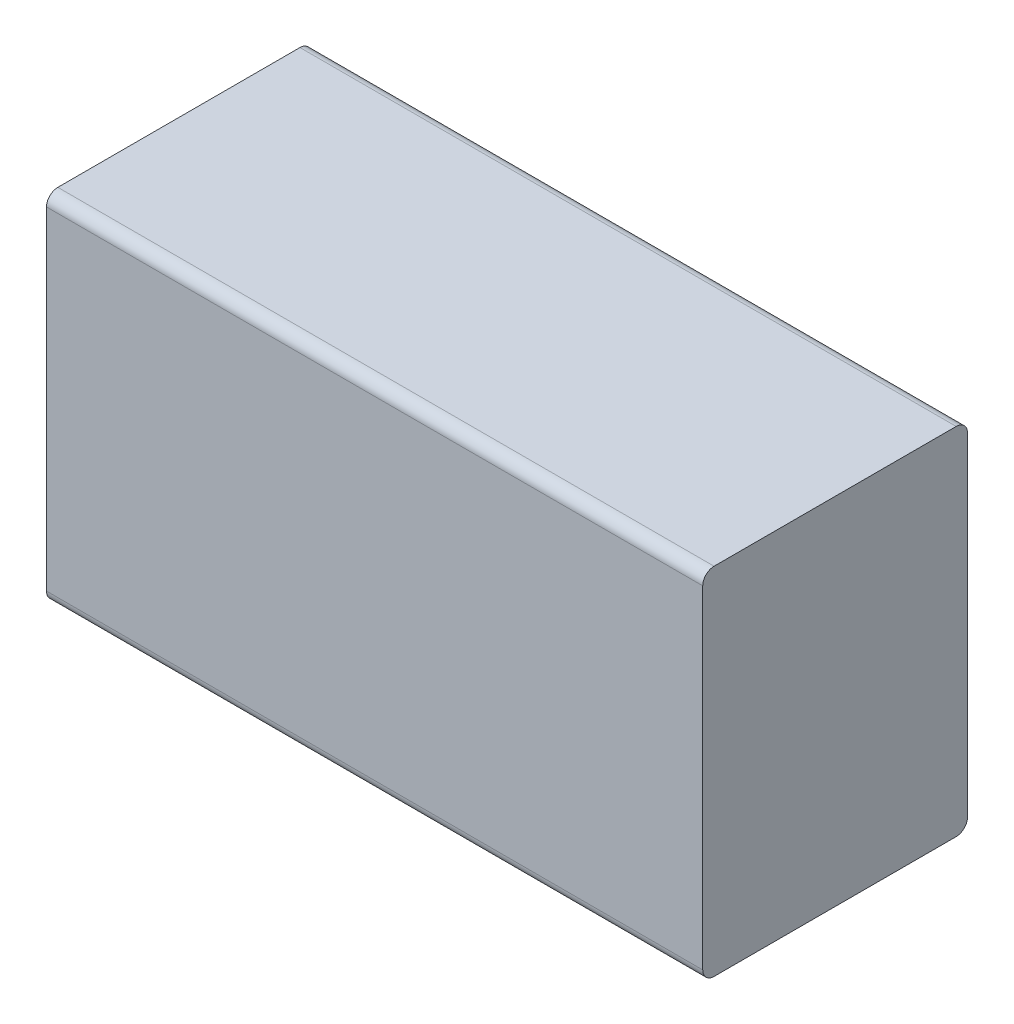
ISO-10303-21;
HEADER;
FILE_DESCRIPTION(('STEP AP214'),'2;1');
FILE_NAME('part.step','',(''),(''),'','','');
FILE_SCHEMA(('AUTOMOTIVE_DESIGN { 1 0 10303 214 1 1 1 1 }'));
ENDSEC;
DATA;
#1=APPLICATION_CONTEXT('core data for automotive mechanical design processes');
#2=APPLICATION_PROTOCOL_DEFINITION('international standard','automotive_design',2000,#1);
#3=PRODUCT_CONTEXT('',#1,'mechanical');
#4=PRODUCT('Part','Part','',(#3));
#5=PRODUCT_RELATED_PRODUCT_CATEGORY('part','',(#4));
#6=PRODUCT_DEFINITION_FORMATION('','',#4);
#7=PRODUCT_DEFINITION_CONTEXT('part definition',#1,'design');
#8=PRODUCT_DEFINITION('design','',#6,#7);
#9=PRODUCT_DEFINITION_SHAPE('','',#8);
#10=(LENGTH_UNIT() NAMED_UNIT(*) SI_UNIT(.MILLI.,.METRE.));
#11=(NAMED_UNIT(*) PLANE_ANGLE_UNIT() SI_UNIT($,.RADIAN.));
#12=(NAMED_UNIT(*) SI_UNIT($,.STERADIAN.) SOLID_ANGLE_UNIT());
#13=UNCERTAINTY_MEASURE_WITH_UNIT(LENGTH_MEASURE(1.E-05),#10,'distance_accuracy_value','');
#14=(GEOMETRIC_REPRESENTATION_CONTEXT(3) GLOBAL_UNCERTAINTY_ASSIGNED_CONTEXT((#13)) GLOBAL_UNIT_ASSIGNED_CONTEXT((#10,
#11,#12)) REPRESENTATION_CONTEXT('',''));
#15=CARTESIAN_POINT('',(0.,0.,0.));
#16=DIRECTION('',(0.,0.,1.));
#17=DIRECTION('',(1.,0.,0.));
#18=AXIS2_PLACEMENT_3D('',#15,#16,#17);
#19=CARTESIAN_POINT('',(0.,-0.735,1.135));
#20=DIRECTION('',(-1.,0.,0.));
#21=DIRECTION('',(0.,0.,-1.));
#22=AXIS2_PLACEMENT_3D('',#19,#20,#21);
#23=CYLINDRICAL_SURFACE('',#22,0.05);
#24=CARTESIAN_POINT('',(1.45,-0.735,1.135));
#25=DIRECTION('',(1.,0.,0.));
#26=DIRECTION('',(0.,0.,-1.));
#27=AXIS2_PLACEMENT_3D('',#24,#25,#26);
#28=CIRCLE('',#27,0.05);
#29=CARTESIAN_POINT('',(1.45,-0.735,1.185));
#30=VERTEX_POINT('',#29);
#31=CARTESIAN_POINT('',(1.45,-0.785,1.135));
#32=VERTEX_POINT('',#31);
#33=EDGE_CURVE('E42',#30,#32,#28,.T.);
#34=ORIENTED_EDGE('',*,*,#33,.F.);
#35=DIRECTION('',(1.,0.,0.));
#36=VECTOR('',#35,1.);
#37=CARTESIAN_POINT('',(1.45,-0.735,1.185));
#38=LINE('',#37,#36);
#39=CARTESIAN_POINT('',(-1.45,-0.735,1.185));
#40=VERTEX_POINT('',#39);
#41=EDGE_CURVE('E152',#40,#30,#38,.T.);
#42=ORIENTED_EDGE('',*,*,#41,.F.);
#43=CARTESIAN_POINT('',(-1.45,-0.735,1.135));
#44=DIRECTION('',(-1.,0.,0.));
#45=DIRECTION('',(0.,0.,-1.));
#46=AXIS2_PLACEMENT_3D('',#43,#44,#45);
#47=CIRCLE('',#46,0.05);
#48=CARTESIAN_POINT('',(-1.45,-0.785,1.135));
#49=VERTEX_POINT('',#48);
#50=EDGE_CURVE('E170',#49,#40,#47,.T.);
#51=ORIENTED_EDGE('',*,*,#50,.F.);
#52=DIRECTION('',(-1.,0.,0.));
#53=VECTOR('',#52,1.);
#54=CARTESIAN_POINT('',(-1.45,-0.785,1.135));
#55=LINE('',#54,#53);
#56=EDGE_CURVE('E11',#32,#49,#55,.T.);
#57=ORIENTED_EDGE('',*,*,#56,.F.);
#58=EDGE_LOOP('',(#34,#42,#51,#57));
#59=FACE_BOUND('',#58,.T.);
#60=ADVANCED_FACE('F17',(#59),#23,.T.);
#61=CARTESIAN_POINT('',(0.,-0.735,0.065));
#62=DIRECTION('',(1.,0.,0.));
#63=DIRECTION('',(0.,0.,1.));
#64=AXIS2_PLACEMENT_3D('',#61,#62,#63);
#65=CYLINDRICAL_SURFACE('',#64,0.05);
#66=CARTESIAN_POINT('',(1.45,-0.735,0.065));
#67=DIRECTION('',(1.,0.,0.));
#68=DIRECTION('',(0.,0.,-1.));
#69=AXIS2_PLACEMENT_3D('',#66,#67,#68);
#70=CIRCLE('',#69,0.05);
#71=CARTESIAN_POINT('',(1.45,-0.785,0.065));
#72=VERTEX_POINT('',#71);
#73=CARTESIAN_POINT('',(1.45,-0.735,0.015));
#74=VERTEX_POINT('',#73);
#75=EDGE_CURVE('E88',#72,#74,#70,.T.);
#76=ORIENTED_EDGE('',*,*,#75,.F.);
#77=DIRECTION('',(1.,0.,0.));
#78=VECTOR('',#77,1.);
#79=CARTESIAN_POINT('',(0.,-0.785,0.065));
#80=LINE('',#79,#78);
#81=CARTESIAN_POINT('',(-1.45,-0.785,0.065));
#82=VERTEX_POINT('',#81);
#83=EDGE_CURVE('E130',#82,#72,#80,.T.);
#84=ORIENTED_EDGE('',*,*,#83,.F.);
#85=CARTESIAN_POINT('',(-1.45,-0.735,0.065));
#86=DIRECTION('',(-1.,0.,0.));
#87=DIRECTION('',(0.,0.,-1.));
#88=AXIS2_PLACEMENT_3D('',#85,#86,#87);
#89=CIRCLE('',#88,0.05);
#90=CARTESIAN_POINT('',(-1.45,-0.735,0.0149999999999998));
#91=VERTEX_POINT('',#90);
#92=EDGE_CURVE('E104',#91,#82,#89,.T.);
#93=ORIENTED_EDGE('',*,*,#92,.F.);
#94=DIRECTION('',(-1.,0.,0.));
#95=VECTOR('',#94,1.);
#96=CARTESIAN_POINT('',(0.,-0.735,0.015));
#97=LINE('',#96,#95);
#98=EDGE_CURVE('E102',#74,#91,#97,.T.);
#99=ORIENTED_EDGE('',*,*,#98,.F.);
#100=EDGE_LOOP('',(#76,#84,#93,#99));
#101=FACE_BOUND('',#100,.T.);
#102=ADVANCED_FACE('F103',(#101),#65,.T.);
#103=CARTESIAN_POINT('',(0.,0.735,1.135));
#104=DIRECTION('',(-1.,0.,0.));
#105=DIRECTION('',(0.,0.,-1.));
#106=AXIS2_PLACEMENT_3D('',#103,#104,#105);
#107=CYLINDRICAL_SURFACE('',#106,0.05);
#108=CARTESIAN_POINT('',(1.45,0.735,1.135));
#109=DIRECTION('',(1.,0.,0.));
#110=DIRECTION('',(0.,0.,-1.));
#111=AXIS2_PLACEMENT_3D('',#108,#109,#110);
#112=CIRCLE('',#111,0.05);
#113=CARTESIAN_POINT('',(1.45,0.785,1.135));
#114=VERTEX_POINT('',#113);
#115=CARTESIAN_POINT('',(1.45,0.735,1.185));
#116=VERTEX_POINT('',#115);
#117=EDGE_CURVE('E121',#114,#116,#112,.T.);
#118=ORIENTED_EDGE('',*,*,#117,.F.);
#119=DIRECTION('',(1.,0.,0.));
#120=VECTOR('',#119,1.);
#121=CARTESIAN_POINT('',(1.45,0.785,1.135));
#122=LINE('',#121,#120);
#123=CARTESIAN_POINT('',(-1.45,0.785,1.135));
#124=VERTEX_POINT('',#123);
#125=EDGE_CURVE('E125',#124,#114,#122,.T.);
#126=ORIENTED_EDGE('',*,*,#125,.F.);
#127=CARTESIAN_POINT('',(-1.45,0.735,1.135));
#128=DIRECTION('',(-1.,0.,0.));
#129=DIRECTION('',(0.,0.,-1.));
#130=AXIS2_PLACEMENT_3D('',#127,#128,#129);
#131=CIRCLE('',#130,0.05);
#132=CARTESIAN_POINT('',(-1.45,0.735,1.185));
#133=VERTEX_POINT('',#132);
#134=EDGE_CURVE('E146',#133,#124,#131,.T.);
#135=ORIENTED_EDGE('',*,*,#134,.F.);
#136=DIRECTION('',(-1.,0.,0.));
#137=VECTOR('',#136,1.);
#138=CARTESIAN_POINT('',(-1.45,0.735,1.185));
#139=LINE('',#138,#137);
#140=EDGE_CURVE('E148',#116,#133,#139,.T.);
#141=ORIENTED_EDGE('',*,*,#140,.F.);
#142=EDGE_LOOP('',(#118,#126,#135,#141));
#143=FACE_BOUND('',#142,.T.);
#144=ADVANCED_FACE('F186',(#143),#107,.T.);
#145=CARTESIAN_POINT('',(0.,0.735,0.065));
#146=DIRECTION('',(1.,0.,0.));
#147=DIRECTION('',(0.,0.,1.));
#148=AXIS2_PLACEMENT_3D('',#145,#146,#147);
#149=CYLINDRICAL_SURFACE('',#148,0.05);
#150=CARTESIAN_POINT('',(1.45,0.735,0.065));
#151=DIRECTION('',(1.,0.,0.));
#152=DIRECTION('',(0.,0.,-1.));
#153=AXIS2_PLACEMENT_3D('',#150,#151,#152);
#154=CIRCLE('',#153,0.05);
#155=CARTESIAN_POINT('',(1.45,0.735,0.015));
#156=VERTEX_POINT('',#155);
#157=CARTESIAN_POINT('',(1.45,0.785,0.065));
#158=VERTEX_POINT('',#157);
#159=EDGE_CURVE('E115',#156,#158,#154,.T.);
#160=ORIENTED_EDGE('',*,*,#159,.F.);
#161=DIRECTION('',(1.,0.,0.));
#162=VECTOR('',#161,1.);
#163=CARTESIAN_POINT('',(0.,0.735,0.015));
#164=LINE('',#163,#162);
#165=CARTESIAN_POINT('',(-1.45,0.735,0.0149999999999998));
#166=VERTEX_POINT('',#165);
#167=EDGE_CURVE('E109',#166,#156,#164,.T.);
#168=ORIENTED_EDGE('',*,*,#167,.F.);
#169=CARTESIAN_POINT('',(-1.45,0.735,0.065));
#170=DIRECTION('',(-1.,0.,0.));
#171=DIRECTION('',(0.,0.,-1.));
#172=AXIS2_PLACEMENT_3D('',#169,#170,#171);
#173=CIRCLE('',#172,0.05);
#174=CARTESIAN_POINT('',(-1.45,0.785,0.065));
#175=VERTEX_POINT('',#174);
#176=EDGE_CURVE('E160',#175,#166,#173,.T.);
#177=ORIENTED_EDGE('',*,*,#176,.F.);
#178=DIRECTION('',(-1.,0.,0.));
#179=VECTOR('',#178,1.);
#180=CARTESIAN_POINT('',(0.,0.785,0.065));
#181=LINE('',#180,#179);
#182=EDGE_CURVE('E142',#158,#175,#181,.T.);
#183=ORIENTED_EDGE('',*,*,#182,.F.);
#184=EDGE_LOOP('',(#160,#168,#177,#183));
#185=FACE_BOUND('',#184,.T.);
#186=ADVANCED_FACE('F207',(#185),#149,.T.);
#187=CARTESIAN_POINT('',(0.,-0.785,0.6));
#188=DIRECTION('',(0.,-1.,0.));
#189=DIRECTION('',(0.,0.,-1.));
#190=AXIS2_PLACEMENT_3D('',#187,#188,#189);
#191=PLANE('',#190);
#192=DIRECTION('',(0.,0.,-1.));
#193=VECTOR('',#192,1.);
#194=CARTESIAN_POINT('',(1.45,-0.785,0.6));
#195=LINE('',#194,#193);
#196=EDGE_CURVE('E95',#32,#72,#195,.T.);
#197=ORIENTED_EDGE('',*,*,#196,.F.);
#198=ORIENTED_EDGE('',*,*,#56,.T.);
#199=DIRECTION('',(0.,0.,-1.));
#200=VECTOR('',#199,1.);
#201=CARTESIAN_POINT('',(-1.45,-0.785,0.6));
#202=LINE('',#201,#200);
#203=EDGE_CURVE('E28',#49,#82,#202,.T.);
#204=ORIENTED_EDGE('',*,*,#203,.T.);
#205=ORIENTED_EDGE('',*,*,#83,.T.);
#206=EDGE_LOOP('',(#197,#198,#204,#205));
#207=FACE_BOUND('',#206,.T.);
#208=ADVANCED_FACE('F217',(#207),#191,.T.);
#209=CARTESIAN_POINT('',(0.,0.785,0.6));
#210=DIRECTION('',(0.,1.,0.));
#211=DIRECTION('',(1.,0.,0.));
#212=AXIS2_PLACEMENT_3D('',#209,#210,#211);
#213=PLANE('',#212);
#214=DIRECTION('',(0.,0.,-1.));
#215=VECTOR('',#214,1.);
#216=CARTESIAN_POINT('',(1.45,0.785,0.6));
#217=LINE('',#216,#215);
#218=EDGE_CURVE('E136',#114,#158,#217,.T.);
#219=ORIENTED_EDGE('',*,*,#218,.T.);
#220=ORIENTED_EDGE('',*,*,#182,.T.);
#221=DIRECTION('',(0.,0.,-1.));
#222=VECTOR('',#221,1.);
#223=CARTESIAN_POINT('',(-1.45,0.785,0.6));
#224=LINE('',#223,#222);
#225=EDGE_CURVE('E21',#124,#175,#224,.T.);
#226=ORIENTED_EDGE('',*,*,#225,.F.);
#227=ORIENTED_EDGE('',*,*,#125,.T.);
#228=EDGE_LOOP('',(#219,#220,#226,#227));
#229=FACE_BOUND('',#228,.T.);
#230=ADVANCED_FACE('F286',(#229),#213,.T.);
#231=CARTESIAN_POINT('',(0.,-0.785,1.185));
#232=DIRECTION('',(0.,0.,-1.));
#233=DIRECTION('',(0.,-1.,0.));
#234=AXIS2_PLACEMENT_3D('',#231,#232,#233);
#235=PLANE('',#234);
#236=DIRECTION('',(0.,1.,0.));
#237=VECTOR('',#236,1.);
#238=CARTESIAN_POINT('',(1.45,-0.785,1.185));
#239=LINE('',#238,#237);
#240=EDGE_CURVE('E151',#30,#116,#239,.T.);
#241=ORIENTED_EDGE('',*,*,#240,.T.);
#242=ORIENTED_EDGE('',*,*,#140,.T.);
#243=DIRECTION('',(0.,1.,0.));
#244=VECTOR('',#243,1.);
#245=CARTESIAN_POINT('',(-1.45,-0.785,1.185));
#246=LINE('',#245,#244);
#247=EDGE_CURVE('E166',#40,#133,#246,.T.);
#248=ORIENTED_EDGE('',*,*,#247,.F.);
#249=ORIENTED_EDGE('',*,*,#41,.T.);
#250=EDGE_LOOP('',(#241,#242,#248,#249));
#251=FACE_BOUND('',#250,.T.);
#252=ADVANCED_FACE('F19',(#251),#235,.F.);
#253=CARTESIAN_POINT('',(0.,-0.785,0.015));
#254=DIRECTION('',(0.,0.,-1.));
#255=DIRECTION('',(0.,-1.,0.));
#256=AXIS2_PLACEMENT_3D('',#253,#254,#255);
#257=PLANE('',#256);
#258=DIRECTION('',(0.,1.,0.));
#259=VECTOR('',#258,1.);
#260=CARTESIAN_POINT('',(-1.45,-0.785,0.0149999999999998));
#261=LINE('',#260,#259);
#262=EDGE_CURVE('E156',#91,#166,#261,.T.);
#263=ORIENTED_EDGE('',*,*,#262,.T.);
#264=ORIENTED_EDGE('',*,*,#167,.T.);
#265=DIRECTION('',(0.,1.,0.));
#266=VECTOR('',#265,1.);
#267=CARTESIAN_POINT('',(1.45,-0.785,0.015));
#268=LINE('',#267,#266);
#269=EDGE_CURVE('E93',#74,#156,#268,.T.);
#270=ORIENTED_EDGE('',*,*,#269,.F.);
#271=ORIENTED_EDGE('',*,*,#98,.T.);
#272=EDGE_LOOP('',(#263,#264,#270,#271));
#273=FACE_BOUND('',#272,.T.);
#274=ADVANCED_FACE('F112',(#273),#257,.T.);
#275=CARTESIAN_POINT('',(1.45,-0.785,0.6));
#276=DIRECTION('',(1.,0.,0.));
#277=DIRECTION('',(0.,1.,0.));
#278=AXIS2_PLACEMENT_3D('',#275,#276,#277);
#279=PLANE('',#278);
#280=ORIENTED_EDGE('',*,*,#269,.T.);
#281=ORIENTED_EDGE('',*,*,#159,.T.);
#282=ORIENTED_EDGE('',*,*,#218,.F.);
#283=ORIENTED_EDGE('',*,*,#117,.T.);
#284=ORIENTED_EDGE('',*,*,#240,.F.);
#285=ORIENTED_EDGE('',*,*,#33,.T.);
#286=ORIENTED_EDGE('',*,*,#196,.T.);
#287=ORIENTED_EDGE('',*,*,#75,.T.);
#288=EDGE_LOOP('',(#280,#281,#282,#283,#284,#285,#286,#287));
#289=FACE_BOUND('',#288,.T.);
#290=ADVANCED_FACE('F90',(#289),#279,.T.);
#291=CARTESIAN_POINT('',(-1.45,-0.785,0.6));
#292=DIRECTION('',(1.,0.,0.));
#293=DIRECTION('',(0.,0.,1.));
#294=AXIS2_PLACEMENT_3D('',#291,#292,#293);
#295=PLANE('',#294);
#296=ORIENTED_EDGE('',*,*,#225,.T.);
#297=ORIENTED_EDGE('',*,*,#176,.T.);
#298=ORIENTED_EDGE('',*,*,#262,.F.);
#299=ORIENTED_EDGE('',*,*,#92,.T.);
#300=ORIENTED_EDGE('',*,*,#203,.F.);
#301=ORIENTED_EDGE('',*,*,#50,.T.);
#302=ORIENTED_EDGE('',*,*,#247,.T.);
#303=ORIENTED_EDGE('',*,*,#134,.T.);
#304=EDGE_LOOP('',(#296,#297,#298,#299,#300,#301,#302,#303));
#305=FACE_BOUND('',#304,.T.);
#306=ADVANCED_FACE('F202',(#305),#295,.F.);
#307=CLOSED_SHELL('',(#60,#102,#144,#186,#208,#230,#252,#274,#290,#306));
#308=MANIFOLD_SOLID_BREP('B1',#307);
#309=ADVANCED_BREP_SHAPE_REPRESENTATION('',(#18,#308),#14);
#310=SHAPE_DEFINITION_REPRESENTATION(#9,#309);
ENDSEC;
END-ISO-10303-21;
